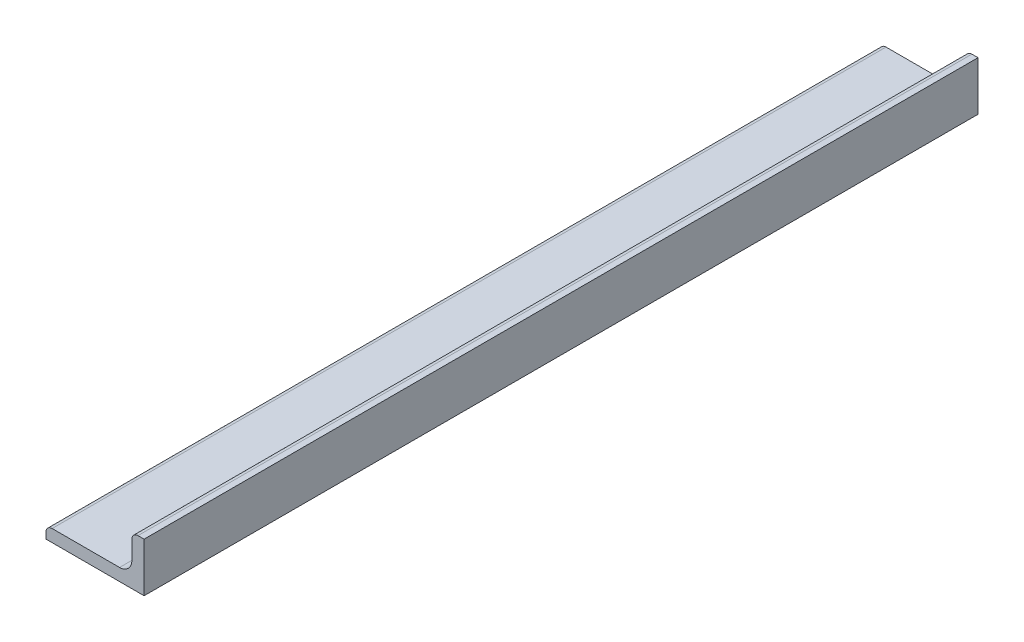
ISO-10303-21;
HEADER;
FILE_DESCRIPTION(('STEP AP214'),'2;1');
FILE_NAME('part.step','',(''),(''),'','','');
FILE_SCHEMA(('AUTOMOTIVE_DESIGN { 1 0 10303 214 1 1 1 1 }'));
ENDSEC;
DATA;
#1=APPLICATION_CONTEXT('core data for automotive mechanical design processes');
#2=APPLICATION_PROTOCOL_DEFINITION('international standard','automotive_design',2000,#1);
#3=PRODUCT_CONTEXT('',#1,'mechanical');
#4=PRODUCT('Part','Part','',(#3));
#5=PRODUCT_RELATED_PRODUCT_CATEGORY('part','',(#4));
#6=PRODUCT_DEFINITION_FORMATION('','',#4);
#7=PRODUCT_DEFINITION_CONTEXT('part definition',#1,'design');
#8=PRODUCT_DEFINITION('design','',#6,#7);
#9=PRODUCT_DEFINITION_SHAPE('','',#8);
#10=(LENGTH_UNIT() NAMED_UNIT(*) SI_UNIT(.MILLI.,.METRE.));
#11=(NAMED_UNIT(*) PLANE_ANGLE_UNIT() SI_UNIT($,.RADIAN.));
#12=(NAMED_UNIT(*) SI_UNIT($,.STERADIAN.) SOLID_ANGLE_UNIT());
#13=UNCERTAINTY_MEASURE_WITH_UNIT(LENGTH_MEASURE(1.E-05),#10,'distance_accuracy_value','');
#14=(GEOMETRIC_REPRESENTATION_CONTEXT(3) GLOBAL_UNCERTAINTY_ASSIGNED_CONTEXT((#13)) GLOBAL_UNIT_ASSIGNED_CONTEXT((#10,
#11,#12)) REPRESENTATION_CONTEXT('',''));
#15=CARTESIAN_POINT('',(0.,0.,0.));
#16=DIRECTION('',(0.,0.,1.));
#17=DIRECTION('',(1.,0.,0.));
#18=AXIS2_PLACEMENT_3D('',#15,#16,#17);
#19=CARTESIAN_POINT('',(-12.7,1.5875,107.95));
#20=DIRECTION('',(1.,0.,0.));
#21=DIRECTION('',(0.,0.,-1.));
#22=AXIS2_PLACEMENT_3D('',#19,#20,#21);
#23=PLANE('',#22);
#24=DIRECTION('',(0.,-1.,0.));
#25=VECTOR('',#24,1.);
#26=CARTESIAN_POINT('',(-12.7,1.5875,-107.95));
#27=LINE('',#26,#25);
#28=CARTESIAN_POINT('',(-12.7,1.5875,-107.95));
#29=VERTEX_POINT('',#28);
#30=CARTESIAN_POINT('',(-12.7,0.,-107.95));
#31=VERTEX_POINT('',#30);
#32=EDGE_CURVE('E135',#29,#31,#27,.T.);
#33=ORIENTED_EDGE('',*,*,#32,.T.);
#34=DIRECTION('',(0.,0.,-1.));
#35=VECTOR('',#34,1.);
#36=CARTESIAN_POINT('',(-12.7,0.,107.95));
#37=LINE('',#36,#35);
#38=CARTESIAN_POINT('',(-12.7,0.,107.95));
#39=VERTEX_POINT('',#38);
#40=EDGE_CURVE('E11',#39,#31,#37,.T.);
#41=ORIENTED_EDGE('',*,*,#40,.F.);
#42=DIRECTION('',(0.,-1.,0.));
#43=VECTOR('',#42,1.);
#44=CARTESIAN_POINT('',(-12.7,1.5875,107.95));
#45=LINE('',#44,#43);
#46=CARTESIAN_POINT('',(-12.7,1.5875,107.95));
#47=VERTEX_POINT('',#46);
#48=EDGE_CURVE('E151',#47,#39,#45,.T.);
#49=ORIENTED_EDGE('',*,*,#48,.F.);
#50=DIRECTION('',(0.,0.,-1.));
#51=VECTOR('',#50,1.);
#52=CARTESIAN_POINT('',(-12.7,1.5875,107.95));
#53=LINE('',#52,#51);
#54=EDGE_CURVE('E131',#47,#29,#53,.T.);
#55=ORIENTED_EDGE('',*,*,#54,.T.);
#56=EDGE_LOOP('',(#33,#41,#49,#55));
#57=FACE_BOUND('',#56,.T.);
#58=ADVANCED_FACE('F33',(#57),#23,.F.);
#59=CARTESIAN_POINT('',(-12.7,0.,107.95));
#60=DIRECTION('',(0.,1.,0.));
#61=DIRECTION('',(0.,0.,1.));
#62=AXIS2_PLACEMENT_3D('',#59,#60,#61);
#63=PLANE('',#62);
#64=DIRECTION('',(1.,0.,0.));
#65=VECTOR('',#64,1.);
#66=CARTESIAN_POINT('',(-12.7,0.,-107.95));
#67=LINE('',#66,#65);
#68=CARTESIAN_POINT('',(12.7,0.,-107.95));
#69=VERTEX_POINT('',#68);
#70=EDGE_CURVE('E138',#31,#69,#67,.T.);
#71=ORIENTED_EDGE('',*,*,#70,.T.);
#72=DIRECTION('',(0.,0.,-1.));
#73=VECTOR('',#72,1.);
#74=CARTESIAN_POINT('',(12.7,0.,107.95));
#75=LINE('',#74,#73);
#76=CARTESIAN_POINT('',(12.7,0.,107.95));
#77=VERTEX_POINT('',#76);
#78=EDGE_CURVE('E41',#77,#69,#75,.T.);
#79=ORIENTED_EDGE('',*,*,#78,.F.);
#80=DIRECTION('',(1.,0.,0.));
#81=VECTOR('',#80,1.);
#82=CARTESIAN_POINT('',(-12.7,0.,107.95));
#83=LINE('',#82,#81);
#84=EDGE_CURVE('E95',#39,#77,#83,.T.);
#85=ORIENTED_EDGE('',*,*,#84,.F.);
#86=ORIENTED_EDGE('',*,*,#40,.T.);
#87=EDGE_LOOP('',(#71,#79,#85,#86));
#88=FACE_BOUND('',#87,.T.);
#89=ADVANCED_FACE('F194',(#88),#63,.F.);
#90=CARTESIAN_POINT('',(12.7,0.,107.95));
#91=DIRECTION('',(-1.,0.,0.));
#92=DIRECTION('',(0.,0.,1.));
#93=AXIS2_PLACEMENT_3D('',#90,#91,#92);
#94=PLANE('',#93);
#95=DIRECTION('',(0.,1.,0.));
#96=VECTOR('',#95,1.);
#97=CARTESIAN_POINT('',(12.7,0.,-107.95));
#98=LINE('',#97,#96);
#99=CARTESIAN_POINT('',(12.7,12.7,-107.95));
#100=VERTEX_POINT('',#99);
#101=EDGE_CURVE('E140',#69,#100,#98,.T.);
#102=ORIENTED_EDGE('',*,*,#101,.T.);
#103=DIRECTION('',(0.,0.,-1.));
#104=VECTOR('',#103,1.);
#105=CARTESIAN_POINT('',(12.7,12.7,107.95));
#106=LINE('',#105,#104);
#107=CARTESIAN_POINT('',(12.7,12.7,107.95));
#108=VERTEX_POINT('',#107);
#109=EDGE_CURVE('E161',#108,#100,#106,.T.);
#110=ORIENTED_EDGE('',*,*,#109,.F.);
#111=DIRECTION('',(0.,1.,0.));
#112=VECTOR('',#111,1.);
#113=CARTESIAN_POINT('',(12.7,0.,107.95));
#114=LINE('',#113,#112);
#115=EDGE_CURVE('E169',#77,#108,#114,.T.);
#116=ORIENTED_EDGE('',*,*,#115,.F.);
#117=ORIENTED_EDGE('',*,*,#78,.T.);
#118=EDGE_LOOP('',(#102,#110,#116,#117));
#119=FACE_BOUND('',#118,.T.);
#120=ADVANCED_FACE('F167',(#119),#94,.F.);
#121=CARTESIAN_POINT('',(11.1125,12.7,107.95));
#122=DIRECTION('',(0.,-1.,0.));
#123=DIRECTION('',(1.,0.,0.));
#124=AXIS2_PLACEMENT_3D('',#121,#122,#123);
#125=PLANE('',#124);
#126=DIRECTION('',(-1.,0.,0.));
#127=VECTOR('',#126,1.);
#128=CARTESIAN_POINT('',(11.1125,12.7,-107.95));
#129=LINE('',#128,#127);
#130=CARTESIAN_POINT('',(11.1125,12.7,-107.95));
#131=VERTEX_POINT('',#130);
#132=EDGE_CURVE('E142',#100,#131,#129,.T.);
#133=ORIENTED_EDGE('',*,*,#132,.T.);
#134=DIRECTION('',(0.,0.,-1.));
#135=VECTOR('',#134,1.);
#136=CARTESIAN_POINT('',(11.1125,12.7,107.95));
#137=LINE('',#136,#135);
#138=CARTESIAN_POINT('',(11.1125,12.7,107.95));
#139=VERTEX_POINT('',#138);
#140=EDGE_CURVE('E158',#139,#131,#137,.T.);
#141=ORIENTED_EDGE('',*,*,#140,.F.);
#142=DIRECTION('',(-1.,0.,0.));
#143=VECTOR('',#142,1.);
#144=CARTESIAN_POINT('',(11.1125,12.7,107.95));
#145=LINE('',#144,#143);
#146=EDGE_CURVE('E185',#108,#139,#145,.T.);
#147=ORIENTED_EDGE('',*,*,#146,.F.);
#148=ORIENTED_EDGE('',*,*,#109,.T.);
#149=EDGE_LOOP('',(#133,#141,#147,#148));
#150=FACE_BOUND('',#149,.T.);
#151=ADVANCED_FACE('F178',(#150),#125,.F.);
#152=CARTESIAN_POINT('',(11.1125,11.1125,107.95));
#153=DIRECTION('',(0.,0.,-1.));
#154=DIRECTION('',(-1.,0.,0.));
#155=AXIS2_PLACEMENT_3D('',#152,#153,#154);
#156=CYLINDRICAL_SURFACE('',#155,1.5875);
#157=CARTESIAN_POINT('',(11.1125,11.1125,-107.95));
#158=DIRECTION('',(0.,0.,1.));
#159=DIRECTION('',(-1.,0.,0.));
#160=AXIS2_PLACEMENT_3D('',#157,#158,#159);
#161=CIRCLE('',#160,1.5875);
#162=CARTESIAN_POINT('',(9.525,11.1125,-107.95));
#163=VERTEX_POINT('',#162);
#164=EDGE_CURVE('E144',#131,#163,#161,.T.);
#165=ORIENTED_EDGE('',*,*,#164,.T.);
#166=DIRECTION('',(0.,0.,-1.));
#167=VECTOR('',#166,1.);
#168=CARTESIAN_POINT('',(9.525,11.1125,107.95));
#169=LINE('',#168,#167);
#170=CARTESIAN_POINT('',(9.525,11.1125,107.95));
#171=VERTEX_POINT('',#170);
#172=EDGE_CURVE('E155',#171,#163,#169,.T.);
#173=ORIENTED_EDGE('',*,*,#172,.F.);
#174=CARTESIAN_POINT('',(11.1125,11.1125,107.95));
#175=DIRECTION('',(0.,0.,1.));
#176=DIRECTION('',(-1.,0.,0.));
#177=AXIS2_PLACEMENT_3D('',#174,#175,#176);
#178=CIRCLE('',#177,1.5875);
#179=EDGE_CURVE('E184',#139,#171,#178,.T.);
#180=ORIENTED_EDGE('',*,*,#179,.F.);
#181=ORIENTED_EDGE('',*,*,#140,.T.);
#182=EDGE_LOOP('',(#165,#173,#180,#181));
#183=FACE_BOUND('',#182,.T.);
#184=ADVANCED_FACE('F182',(#183),#156,.T.);
#185=CARTESIAN_POINT('',(9.525,11.1125,107.95));
#186=DIRECTION('',(1.,0.,0.));
#187=DIRECTION('',(0.,1.,0.));
#188=AXIS2_PLACEMENT_3D('',#185,#186,#187);
#189=PLANE('',#188);
#190=DIRECTION('',(0.,-1.,0.));
#191=VECTOR('',#190,1.);
#192=CARTESIAN_POINT('',(9.525,11.1125,-107.95));
#193=LINE('',#192,#191);
#194=CARTESIAN_POINT('',(9.52500000000001,6.35,-107.95));
#195=VERTEX_POINT('',#194);
#196=EDGE_CURVE('E146',#163,#195,#193,.T.);
#197=ORIENTED_EDGE('',*,*,#196,.T.);
#198=DIRECTION('',(0.,0.,-1.));
#199=VECTOR('',#198,1.);
#200=CARTESIAN_POINT('',(9.52500000000001,6.35,107.95));
#201=LINE('',#200,#199);
#202=CARTESIAN_POINT('',(9.52500000000001,6.35,107.95));
#203=VERTEX_POINT('',#202);
#204=EDGE_CURVE('E126',#203,#195,#201,.T.);
#205=ORIENTED_EDGE('',*,*,#204,.F.);
#206=DIRECTION('',(0.,-1.,0.));
#207=VECTOR('',#206,1.);
#208=CARTESIAN_POINT('',(9.525,11.1125,107.95));
#209=LINE('',#208,#207);
#210=EDGE_CURVE('E117',#171,#203,#209,.T.);
#211=ORIENTED_EDGE('',*,*,#210,.F.);
#212=ORIENTED_EDGE('',*,*,#172,.T.);
#213=EDGE_LOOP('',(#197,#205,#211,#212));
#214=FACE_BOUND('',#213,.T.);
#215=ADVANCED_FACE('F206',(#214),#189,.F.);
#216=CARTESIAN_POINT('',(6.35,6.35,107.95));
#217=DIRECTION('',(0.,0.,-1.));
#218=DIRECTION('',(-1.,0.,0.));
#219=AXIS2_PLACEMENT_3D('',#216,#217,#218);
#220=CYLINDRICAL_SURFACE('',#219,3.175);
#221=CARTESIAN_POINT('',(6.35,6.35,-107.95));
#222=DIRECTION('',(0.,0.,-1.));
#223=DIRECTION('',(-1.,0.,0.));
#224=AXIS2_PLACEMENT_3D('',#221,#222,#223);
#225=CIRCLE('',#224,3.175);
#226=CARTESIAN_POINT('',(6.35,3.175,-107.95));
#227=VERTEX_POINT('',#226);
#228=EDGE_CURVE('E125',#195,#227,#225,.T.);
#229=ORIENTED_EDGE('',*,*,#228,.T.);
#230=DIRECTION('',(0.,0.,-1.));
#231=VECTOR('',#230,1.);
#232=CARTESIAN_POINT('',(6.35,3.175,107.95));
#233=LINE('',#232,#231);
#234=CARTESIAN_POINT('',(6.35,3.175,107.95));
#235=VERTEX_POINT('',#234);
#236=EDGE_CURVE('E122',#235,#227,#233,.T.);
#237=ORIENTED_EDGE('',*,*,#236,.F.);
#238=CARTESIAN_POINT('',(6.35,6.35,107.95));
#239=DIRECTION('',(0.,0.,-1.));
#240=DIRECTION('',(-1.,0.,0.));
#241=AXIS2_PLACEMENT_3D('',#238,#239,#240);
#242=CIRCLE('',#241,3.175);
#243=EDGE_CURVE('E111',#203,#235,#242,.T.);
#244=ORIENTED_EDGE('',*,*,#243,.F.);
#245=ORIENTED_EDGE('',*,*,#204,.T.);
#246=EDGE_LOOP('',(#229,#237,#244,#245));
#247=FACE_BOUND('',#246,.T.);
#248=ADVANCED_FACE('F123',(#247),#220,.F.);
#249=CARTESIAN_POINT('',(6.35,3.175,107.95));
#250=DIRECTION('',(0.,-1.,0.));
#251=DIRECTION('',(1.,0.,0.));
#252=AXIS2_PLACEMENT_3D('',#249,#250,#251);
#253=PLANE('',#252);
#254=DIRECTION('',(-1.,0.,0.));
#255=VECTOR('',#254,1.);
#256=CARTESIAN_POINT('',(6.35,3.175,-107.95));
#257=LINE('',#256,#255);
#258=CARTESIAN_POINT('',(-11.1125,3.175,-107.95));
#259=VERTEX_POINT('',#258);
#260=EDGE_CURVE('E81',#227,#259,#257,.T.);
#261=ORIENTED_EDGE('',*,*,#260,.T.);
#262=DIRECTION('',(0.,0.,-1.));
#263=VECTOR('',#262,1.);
#264=CARTESIAN_POINT('',(-11.1125,3.175,107.95));
#265=LINE('',#264,#263);
#266=CARTESIAN_POINT('',(-11.1125,3.175,107.95));
#267=VERTEX_POINT('',#266);
#268=EDGE_CURVE('E127',#267,#259,#265,.T.);
#269=ORIENTED_EDGE('',*,*,#268,.F.);
#270=DIRECTION('',(-1.,0.,0.));
#271=VECTOR('',#270,1.);
#272=CARTESIAN_POINT('',(6.35,3.175,107.95));
#273=LINE('',#272,#271);
#274=EDGE_CURVE('E115',#235,#267,#273,.T.);
#275=ORIENTED_EDGE('',*,*,#274,.F.);
#276=ORIENTED_EDGE('',*,*,#236,.T.);
#277=EDGE_LOOP('',(#261,#269,#275,#276));
#278=FACE_BOUND('',#277,.T.);
#279=ADVANCED_FACE('F129',(#278),#253,.F.);
#280=CARTESIAN_POINT('',(-11.1125,1.5875,107.95));
#281=DIRECTION('',(0.,0.,-1.));
#282=DIRECTION('',(-1.,0.,0.));
#283=AXIS2_PLACEMENT_3D('',#280,#281,#282);
#284=CYLINDRICAL_SURFACE('',#283,1.5875);
#285=CARTESIAN_POINT('',(-11.1125,1.5875,-107.95));
#286=DIRECTION('',(0.,0.,1.));
#287=DIRECTION('',(-1.,0.,0.));
#288=AXIS2_PLACEMENT_3D('',#285,#286,#287);
#289=CIRCLE('',#288,1.5875);
#290=EDGE_CURVE('E87',#259,#29,#289,.T.);
#291=ORIENTED_EDGE('',*,*,#290,.T.);
#292=ORIENTED_EDGE('',*,*,#54,.F.);
#293=CARTESIAN_POINT('',(-11.1125,1.5875,107.95));
#294=DIRECTION('',(0.,0.,1.));
#295=DIRECTION('',(-1.,0.,0.));
#296=AXIS2_PLACEMENT_3D('',#293,#294,#295);
#297=CIRCLE('',#296,1.5875);
#298=EDGE_CURVE('E49',#267,#47,#297,.T.);
#299=ORIENTED_EDGE('',*,*,#298,.F.);
#300=ORIENTED_EDGE('',*,*,#268,.T.);
#301=EDGE_LOOP('',(#291,#292,#299,#300));
#302=FACE_BOUND('',#301,.T.);
#303=ADVANCED_FACE('F214',(#302),#284,.T.);
#304=CARTESIAN_POINT('',(11.1125,11.1125,107.95));
#305=DIRECTION('',(0.,0.,-1.));
#306=DIRECTION('',(-1.,0.,0.));
#307=AXIS2_PLACEMENT_3D('',#304,#305,#306);
#308=PLANE('',#307);
#309=ORIENTED_EDGE('',*,*,#48,.T.);
#310=ORIENTED_EDGE('',*,*,#84,.T.);
#311=ORIENTED_EDGE('',*,*,#115,.T.);
#312=ORIENTED_EDGE('',*,*,#146,.T.);
#313=ORIENTED_EDGE('',*,*,#179,.T.);
#314=ORIENTED_EDGE('',*,*,#210,.T.);
#315=ORIENTED_EDGE('',*,*,#243,.T.);
#316=ORIENTED_EDGE('',*,*,#274,.T.);
#317=ORIENTED_EDGE('',*,*,#298,.T.);
#318=EDGE_LOOP('',(#309,#310,#311,#312,#313,#314,#315,#316,#317));
#319=FACE_BOUND('',#318,.T.);
#320=ADVANCED_FACE('F113',(#319),#308,.F.);
#321=CARTESIAN_POINT('',(11.1125,11.1125,-107.95));
#322=DIRECTION('',(0.,0.,-1.));
#323=DIRECTION('',(-1.,0.,0.));
#324=AXIS2_PLACEMENT_3D('',#321,#322,#323);
#325=PLANE('',#324);
#326=ORIENTED_EDGE('',*,*,#32,.F.);
#327=ORIENTED_EDGE('',*,*,#290,.F.);
#328=ORIENTED_EDGE('',*,*,#260,.F.);
#329=ORIENTED_EDGE('',*,*,#228,.F.);
#330=ORIENTED_EDGE('',*,*,#196,.F.);
#331=ORIENTED_EDGE('',*,*,#164,.F.);
#332=ORIENTED_EDGE('',*,*,#132,.F.);
#333=ORIENTED_EDGE('',*,*,#101,.F.);
#334=ORIENTED_EDGE('',*,*,#70,.F.);
#335=EDGE_LOOP('',(#326,#327,#328,#329,#330,#331,#332,#333,#334));
#336=FACE_BOUND('',#335,.T.);
#337=ADVANCED_FACE('F173',(#336),#325,.T.);
#338=CLOSED_SHELL('',(#58,#89,#120,#151,#184,#215,#248,#279,#303,#320,#337));
#339=MANIFOLD_SOLID_BREP('B2',#338);
#340=ADVANCED_BREP_SHAPE_REPRESENTATION('',(#18,#339),#14);
#341=SHAPE_DEFINITION_REPRESENTATION(#9,#340);
ENDSEC;
END-ISO-10303-21;
